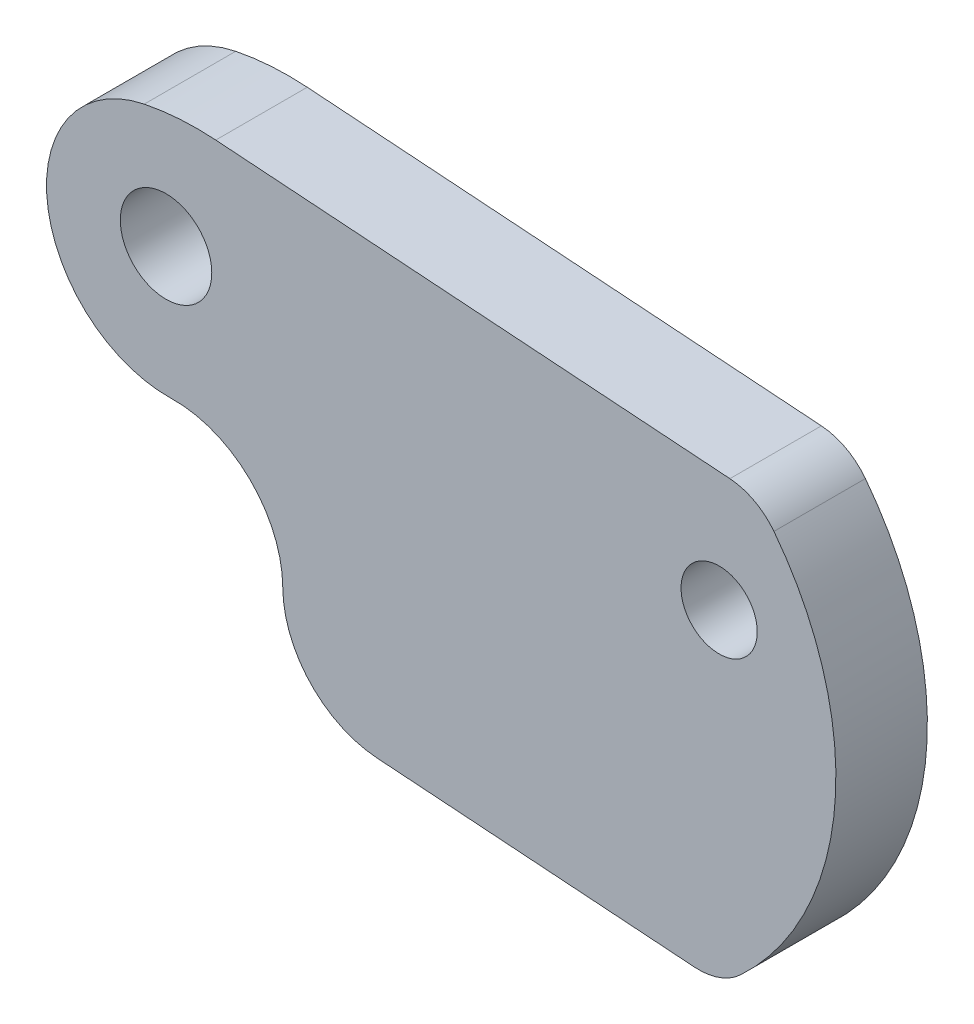
ISO-10303-21;
HEADER;
FILE_DESCRIPTION(('STEP AP214'),'2;1');
FILE_NAME('part.step','',(''),(''),'','','');
FILE_SCHEMA(('AUTOMOTIVE_DESIGN { 1 0 10303 214 1 1 1 1 }'));
ENDSEC;
DATA;
#1=APPLICATION_CONTEXT('core data for automotive mechanical design processes');
#2=APPLICATION_PROTOCOL_DEFINITION('international standard','automotive_design',2000,#1);
#3=PRODUCT_CONTEXT('',#1,'mechanical');
#4=PRODUCT('Part','Part','',(#3));
#5=PRODUCT_RELATED_PRODUCT_CATEGORY('part','',(#4));
#6=PRODUCT_DEFINITION_FORMATION('','',#4);
#7=PRODUCT_DEFINITION_CONTEXT('part definition',#1,'design');
#8=PRODUCT_DEFINITION('design','',#6,#7);
#9=PRODUCT_DEFINITION_SHAPE('','',#8);
#10=(LENGTH_UNIT() NAMED_UNIT(*) SI_UNIT(.MILLI.,.METRE.));
#11=(NAMED_UNIT(*) PLANE_ANGLE_UNIT() SI_UNIT($,.RADIAN.));
#12=(NAMED_UNIT(*) SI_UNIT($,.STERADIAN.) SOLID_ANGLE_UNIT());
#13=UNCERTAINTY_MEASURE_WITH_UNIT(LENGTH_MEASURE(1.E-05),#10,'distance_accuracy_value','');
#14=(GEOMETRIC_REPRESENTATION_CONTEXT(3) GLOBAL_UNCERTAINTY_ASSIGNED_CONTEXT((#13)) GLOBAL_UNIT_ASSIGNED_CONTEXT((#10,
#11,#12)) REPRESENTATION_CONTEXT('',''));
#15=CARTESIAN_POINT('',(0.,0.,0.));
#16=DIRECTION('',(0.,0.,1.));
#17=DIRECTION('',(1.,0.,0.));
#18=AXIS2_PLACEMENT_3D('',#15,#16,#17);
#19=CARTESIAN_POINT('',(1163.33117936609,1704.89898584354,-3.));
#20=DIRECTION('',(0.,0.,1.));
#21=DIRECTION('',(1.,0.,0.));
#22=AXIS2_PLACEMENT_3D('',#19,#20,#21);
#23=CYLINDRICAL_SURFACE('',#22,8.73227138362679);
#24=CARTESIAN_POINT('',(1163.33117936609,1704.89898584354,0.));
#25=DIRECTION('',(0.,0.,1.));
#26=DIRECTION('',(1.,0.,0.));
#27=AXIS2_PLACEMENT_3D('',#24,#25,#26);
#28=CIRCLE('',#27,8.73227138362679);
#29=CARTESIAN_POINT('',(1163.94410284967,1713.60971992975,0.));
#30=VERTEX_POINT('',#29);
#31=CARTESIAN_POINT('',(1161.59842695047,1713.45761497346,0.));
#32=VERTEX_POINT('',#31);
#33=EDGE_CURVE('E151',#30,#32,#28,.T.);
#34=ORIENTED_EDGE('',*,*,#33,.F.);
#35=DIRECTION('',(0.,0.,1.));
#36=VECTOR('',#35,1.);
#37=CARTESIAN_POINT('',(1163.94410284967,1713.60971992975,-3.));
#38=LINE('',#37,#36);
#39=CARTESIAN_POINT('',(1163.94410284967,1713.60971992975,-3.));
#40=VERTEX_POINT('',#39);
#41=EDGE_CURVE('E13',#40,#30,#38,.T.);
#42=ORIENTED_EDGE('',*,*,#41,.F.);
#43=CARTESIAN_POINT('',(1163.33117936609,1704.89898584354,-3.));
#44=DIRECTION('',(0.,0.,1.));
#45=DIRECTION('',(1.,0.,0.));
#46=AXIS2_PLACEMENT_3D('',#43,#44,#45);
#47=CIRCLE('',#46,8.73227138362679);
#48=CARTESIAN_POINT('',(1161.59842695047,1713.45761497346,-3.));
#49=VERTEX_POINT('',#48);
#50=EDGE_CURVE('E175',#40,#49,#47,.T.);
#51=ORIENTED_EDGE('',*,*,#50,.T.);
#52=DIRECTION('',(0.,0.,1.));
#53=VECTOR('',#52,1.);
#54=CARTESIAN_POINT('',(1161.59842695047,1713.45761497346,-3.));
#55=LINE('',#54,#53);
#56=EDGE_CURVE('E51',#49,#32,#55,.T.);
#57=ORIENTED_EDGE('',*,*,#56,.T.);
#58=EDGE_LOOP('',(#34,#42,#51,#57));
#59=FACE_BOUND('',#58,.T.);
#60=ADVANCED_FACE('F48',(#59),#23,.T.);
#61=CARTESIAN_POINT('',(1180.80632932412,1712.42322353468,-3.));
#62=DIRECTION('',(0.0701906132614009,0.997533597333939,0.));
#63=DIRECTION('',(-0.997533597333939,0.0701906132614009,0.));
#64=AXIS2_PLACEMENT_3D('',#61,#62,#63);
#65=PLANE('',#64);
#66=DIRECTION('',(-0.997533597333939,0.0701906132614009,0.));
#67=VECTOR('',#66,1.);
#68=CARTESIAN_POINT('',(1180.80632932412,1712.42322353468,0.));
#69=LINE('',#68,#67);
#70=CARTESIAN_POINT('',(1180.80632932412,1712.42322353468,0.));
#71=VERTEX_POINT('',#70);
#72=EDGE_CURVE('E173',#71,#30,#69,.T.);
#73=ORIENTED_EDGE('',*,*,#72,.F.);
#74=DIRECTION('',(0.,0.,1.));
#75=VECTOR('',#74,1.);
#76=CARTESIAN_POINT('',(1180.80632932412,1712.42322353468,-3.));
#77=LINE('',#76,#75);
#78=CARTESIAN_POINT('',(1180.80632932412,1712.42322353468,-3.));
#79=VERTEX_POINT('',#78);
#80=EDGE_CURVE('E57',#79,#71,#77,.T.);
#81=ORIENTED_EDGE('',*,*,#80,.F.);
#82=DIRECTION('',(-0.997533597333939,0.0701906132614009,0.));
#83=VECTOR('',#82,1.);
#84=CARTESIAN_POINT('',(1180.80632932412,1712.42322353468,-3.));
#85=LINE('',#84,#83);
#86=EDGE_CURVE('E141',#79,#40,#85,.T.);
#87=ORIENTED_EDGE('',*,*,#86,.T.);
#88=ORIENTED_EDGE('',*,*,#41,.T.);
#89=EDGE_LOOP('',(#73,#81,#87,#88));
#90=FACE_BOUND('',#89,.T.);
#91=ADVANCED_FACE('F189',(#90),#65,.T.);
#92=CARTESIAN_POINT('',(1180.6659480976,1710.42815634001,-3.));
#93=DIRECTION('',(0.,0.,1.));
#94=DIRECTION('',(1.,0.,0.));
#95=AXIS2_PLACEMENT_3D('',#92,#93,#94);
#96=CYLINDRICAL_SURFACE('',#95,1.99999999999984);
#97=CARTESIAN_POINT('',(1180.6659480976,1710.42815634001,0.));
#98=DIRECTION('',(0.,0.,1.));
#99=DIRECTION('',(-1.,0.,0.));
#100=AXIS2_PLACEMENT_3D('',#97,#98,#99);
#101=CIRCLE('',#100,1.99999999999984);
#102=CARTESIAN_POINT('',(1182.25072926828,1711.64818447127,0.));
#103=VERTEX_POINT('',#102);
#104=EDGE_CURVE('E128',#103,#71,#101,.T.);
#105=ORIENTED_EDGE('',*,*,#104,.F.);
#106=DIRECTION('',(0.,0.,1.));
#107=VECTOR('',#106,1.);
#108=CARTESIAN_POINT('',(1182.25072926828,1711.64818447127,-3.));
#109=LINE('',#108,#107);
#110=CARTESIAN_POINT('',(1182.25072926828,1711.64818447127,-3.));
#111=VERTEX_POINT('',#110);
#112=EDGE_CURVE('E123',#111,#103,#109,.T.);
#113=ORIENTED_EDGE('',*,*,#112,.F.);
#114=CARTESIAN_POINT('',(1180.6659480976,1710.42815634001,-3.));
#115=DIRECTION('',(0.,0.,1.));
#116=DIRECTION('',(-1.,0.,0.));
#117=AXIS2_PLACEMENT_3D('',#114,#115,#116);
#118=CIRCLE('',#117,1.99999999999984);
#119=EDGE_CURVE('E126',#111,#79,#118,.T.);
#120=ORIENTED_EDGE('',*,*,#119,.T.);
#121=ORIENTED_EDGE('',*,*,#80,.T.);
#122=EDGE_LOOP('',(#105,#113,#120,#121));
#123=FACE_BOUND('',#122,.T.);
#124=ADVANCED_FACE('F125',(#123),#96,.T.);
#125=CARTESIAN_POINT('',(1174.4950828996,1705.67757671737,-3.));
#126=DIRECTION('',(0.,0.,1.));
#127=DIRECTION('',(1.,0.,0.));
#128=AXIS2_PLACEMENT_3D('',#125,#126,#127);
#129=CYLINDRICAL_SURFACE('',#128,9.78765587599625);
#130=CARTESIAN_POINT('',(1174.4950828996,1705.67757671737,0.));
#131=DIRECTION('',(0.,0.,1.));
#132=DIRECTION('',(-1.,0.,0.));
#133=AXIS2_PLACEMENT_3D('',#130,#131,#132);
#134=CIRCLE('',#133,9.78765587599625);
#135=CARTESIAN_POINT('',(1181.14591059589,1698.49672032685,0.));
#136=VERTEX_POINT('',#135);
#137=EDGE_CURVE('E170',#136,#103,#134,.T.);
#138=ORIENTED_EDGE('',*,*,#137,.F.);
#139=DIRECTION('',(0.,0.,1.));
#140=VECTOR('',#139,1.);
#141=CARTESIAN_POINT('',(1181.14591059589,1698.49672032685,-3.));
#142=LINE('',#141,#140);
#143=CARTESIAN_POINT('',(1181.14591059589,1698.49672032685,-3.));
#144=VERTEX_POINT('',#143);
#145=EDGE_CURVE('E133',#144,#136,#142,.T.);
#146=ORIENTED_EDGE('',*,*,#145,.F.);
#147=CARTESIAN_POINT('',(1174.4950828996,1705.67757671737,-3.));
#148=DIRECTION('',(0.,0.,1.));
#149=DIRECTION('',(-1.,0.,0.));
#150=AXIS2_PLACEMENT_3D('',#147,#148,#149);
#151=CIRCLE('',#150,9.78765587599625);
#152=EDGE_CURVE('E139',#144,#111,#151,.T.);
#153=ORIENTED_EDGE('',*,*,#152,.T.);
#154=ORIENTED_EDGE('',*,*,#112,.T.);
#155=EDGE_LOOP('',(#138,#146,#153,#154));
#156=FACE_BOUND('',#155,.T.);
#157=ADVANCED_FACE('F143',(#156),#129,.T.);
#158=CARTESIAN_POINT('',(1179.7868869889,1699.96404947726,-3.));
#159=DIRECTION('',(0.,0.,1.));
#160=DIRECTION('',(1.,0.,0.));
#161=AXIS2_PLACEMENT_3D('',#158,#159,#160);
#162=CYLINDRICAL_SURFACE('',#161,1.9999999999999);
#163=CARTESIAN_POINT('',(1179.7868869889,1699.96404947726,0.));
#164=DIRECTION('',(0.,0.,1.));
#165=DIRECTION('',(1.,0.,0.));
#166=AXIS2_PLACEMENT_3D('',#163,#164,#165);
#167=CIRCLE('',#166,1.9999999999999);
#168=CARTESIAN_POINT('',(1179.64650576238,1697.96898228259,0.));
#169=VERTEX_POINT('',#168);
#170=EDGE_CURVE('E167',#169,#136,#167,.T.);
#171=ORIENTED_EDGE('',*,*,#170,.F.);
#172=DIRECTION('',(0.,0.,1.));
#173=VECTOR('',#172,1.);
#174=CARTESIAN_POINT('',(1179.64650576238,1697.96898228259,-3.));
#175=LINE('',#174,#173);
#176=CARTESIAN_POINT('',(1179.64650576238,1697.96898228259,-3.));
#177=VERTEX_POINT('',#176);
#178=EDGE_CURVE('E179',#177,#169,#175,.T.);
#179=ORIENTED_EDGE('',*,*,#178,.F.);
#180=CARTESIAN_POINT('',(1179.7868869889,1699.96404947726,-3.));
#181=DIRECTION('',(0.,0.,1.));
#182=DIRECTION('',(1.,0.,0.));
#183=AXIS2_PLACEMENT_3D('',#180,#181,#182);
#184=CIRCLE('',#183,1.9999999999999);
#185=EDGE_CURVE('E144',#177,#144,#184,.T.);
#186=ORIENTED_EDGE('',*,*,#185,.T.);
#187=ORIENTED_EDGE('',*,*,#145,.T.);
#188=EDGE_LOOP('',(#171,#179,#186,#187));
#189=FACE_BOUND('',#188,.T.);
#190=ADVANCED_FACE('F202',(#189),#162,.T.);
#191=CARTESIAN_POINT('',(1169.22988432262,1698.7019390962,-3.));
#192=DIRECTION('',(-0.0701906132614025,-0.997533597333939,0.));
#193=DIRECTION('',(0.997533597333939,-0.0701906132614025,0.));
#194=AXIS2_PLACEMENT_3D('',#191,#192,#193);
#195=PLANE('',#194);
#196=DIRECTION('',(0.997533597333939,-0.0701906132614025,0.));
#197=VECTOR('',#196,1.);
#198=CARTESIAN_POINT('',(1169.22988432262,1698.7019390962,0.));
#199=LINE('',#198,#197);
#200=CARTESIAN_POINT('',(1169.22988432262,1698.7019390962,0.));
#201=VERTEX_POINT('',#200);
#202=EDGE_CURVE('E164',#201,#169,#199,.T.);
#203=ORIENTED_EDGE('',*,*,#202,.F.);
#204=DIRECTION('',(0.,0.,1.));
#205=VECTOR('',#204,1.);
#206=CARTESIAN_POINT('',(1169.22988432262,1698.7019390962,-3.));
#207=LINE('',#206,#205);
#208=CARTESIAN_POINT('',(1169.22988432262,1698.7019390962,-3.));
#209=VERTEX_POINT('',#208);
#210=EDGE_CURVE('E181',#209,#201,#207,.T.);
#211=ORIENTED_EDGE('',*,*,#210,.F.);
#212=DIRECTION('',(0.997533597333939,-0.0701906132614025,0.));
#213=VECTOR('',#212,1.);
#214=CARTESIAN_POINT('',(1169.22988432262,1698.7019390962,-3.));
#215=LINE('',#214,#213);
#216=EDGE_CURVE('E146',#209,#177,#215,.T.);
#217=ORIENTED_EDGE('',*,*,#216,.T.);
#218=ORIENTED_EDGE('',*,*,#178,.T.);
#219=EDGE_LOOP('',(#203,#211,#217,#218));
#220=FACE_BOUND('',#219,.T.);
#221=ADVANCED_FACE('F205',(#220),#195,.T.);
#222=CARTESIAN_POINT('',(1169.46299438031,1702.01484809677,-3.));
#223=DIRECTION('',(0.,0.,1.));
#224=DIRECTION('',(1.,0.,0.));
#225=AXIS2_PLACEMENT_3D('',#222,#223,#224);
#226=CYLINDRICAL_SURFACE('',#225,3.32110017088489);
#227=CARTESIAN_POINT('',(1169.46299438031,1702.01484809677,0.));
#228=DIRECTION('',(0.,0.,1.));
#229=DIRECTION('',(1.,0.,0.));
#230=AXIS2_PLACEMENT_3D('',#227,#228,#229);
#231=CIRCLE('',#230,3.32110017088489);
#232=CARTESIAN_POINT('',(1166.14194796575,1701.9959521345,0.));
#233=VERTEX_POINT('',#232);
#234=EDGE_CURVE('E161',#233,#201,#231,.T.);
#235=ORIENTED_EDGE('',*,*,#234,.F.);
#236=DIRECTION('',(0.,0.,1.));
#237=VECTOR('',#236,1.);
#238=CARTESIAN_POINT('',(1166.14194796575,1701.9959521345,-3.));
#239=LINE('',#238,#237);
#240=CARTESIAN_POINT('',(1166.14194796575,1701.9959521345,-3.));
#241=VERTEX_POINT('',#240);
#242=EDGE_CURVE('E183',#241,#233,#239,.T.);
#243=ORIENTED_EDGE('',*,*,#242,.F.);
#244=CARTESIAN_POINT('',(1169.46299438031,1702.01484809677,-3.));
#245=DIRECTION('',(0.,0.,1.));
#246=DIRECTION('',(1.,0.,0.));
#247=AXIS2_PLACEMENT_3D('',#244,#245,#246);
#248=CIRCLE('',#247,3.32110017088489);
#249=EDGE_CURVE('E258',#241,#209,#248,.T.);
#250=ORIENTED_EDGE('',*,*,#249,.T.);
#251=ORIENTED_EDGE('',*,*,#210,.T.);
#252=EDGE_LOOP('',(#235,#243,#250,#251));
#253=FACE_BOUND('',#252,.T.);
#254=ADVANCED_FACE('F209',(#253),#226,.T.);
#255=CARTESIAN_POINT('',(1162.57534174844,1701.9756589955,-3.));
#256=DIRECTION('',(0.,0.,1.));
#257=DIRECTION('',(1.,0.,0.));
#258=AXIS2_PLACEMENT_3D('',#255,#256,#257);
#259=CYLINDRICAL_SURFACE('',#258,3.56666394840348);
#260=CARTESIAN_POINT('',(1162.57534174844,1701.9756589955,0.));
#261=DIRECTION('',(0.,0.,-1.));
#262=DIRECTION('',(-1.,0.,0.));
#263=AXIS2_PLACEMENT_3D('',#260,#261,#262);
#264=CIRCLE('',#263,3.56666394840348);
#265=CARTESIAN_POINT('',(1162.48883577837,1705.54127373043,0.));
#266=VERTEX_POINT('',#265);
#267=EDGE_CURVE('E158',#266,#233,#264,.T.);
#268=ORIENTED_EDGE('',*,*,#267,.F.);
#269=DIRECTION('',(0.,0.,1.));
#270=VECTOR('',#269,1.);
#271=CARTESIAN_POINT('',(1162.48883577837,1705.54127373043,-3.));
#272=LINE('',#271,#270);
#273=CARTESIAN_POINT('',(1162.48883577837,1705.54127373043,-3.));
#274=VERTEX_POINT('',#273);
#275=EDGE_CURVE('E184',#274,#266,#272,.T.);
#276=ORIENTED_EDGE('',*,*,#275,.F.);
#277=CARTESIAN_POINT('',(1162.57534174844,1701.9756589955,-3.));
#278=DIRECTION('',(0.,0.,-1.));
#279=DIRECTION('',(-1.,0.,0.));
#280=AXIS2_PLACEMENT_3D('',#277,#278,#279);
#281=CIRCLE('',#280,3.56666394840348);
#282=EDGE_CURVE('E255',#274,#241,#281,.T.);
#283=ORIENTED_EDGE('',*,*,#282,.T.);
#284=ORIENTED_EDGE('',*,*,#242,.T.);
#285=EDGE_LOOP('',(#268,#276,#283,#284));
#286=FACE_BOUND('',#285,.T.);
#287=ADVANCED_FACE('F213',(#286),#259,.F.);
#288=CARTESIAN_POINT('',(1162.39185569955,1709.53861169107,-3.));
#289=DIRECTION('',(0.,0.,1.));
#290=DIRECTION('',(1.,0.,0.));
#291=AXIS2_PLACEMENT_3D('',#288,#289,#290);
#292=CYLINDRICAL_SURFACE('',#291,3.99851421245832);
#293=CARTESIAN_POINT('',(1162.39185569955,1709.53861169107,0.));
#294=DIRECTION('',(0.,0.,1.));
#295=DIRECTION('',(1.,0.,0.));
#296=AXIS2_PLACEMENT_3D('',#293,#294,#295);
#297=CIRCLE('',#296,3.99851421245832);
#298=EDGE_CURVE('E154',#32,#266,#297,.T.);
#299=ORIENTED_EDGE('',*,*,#298,.F.);
#300=ORIENTED_EDGE('',*,*,#56,.F.);
#301=CARTESIAN_POINT('',(1162.39185569955,1709.53861169107,-3.));
#302=DIRECTION('',(0.,0.,1.));
#303=DIRECTION('',(1.,0.,0.));
#304=AXIS2_PLACEMENT_3D('',#301,#302,#303);
#305=CIRCLE('',#304,3.99851421245832);
#306=EDGE_CURVE('E253',#49,#274,#305,.T.);
#307=ORIENTED_EDGE('',*,*,#306,.T.);
#308=ORIENTED_EDGE('',*,*,#275,.T.);
#309=EDGE_LOOP('',(#299,#300,#307,#308));
#310=FACE_BOUND('',#309,.T.);
#311=ADVANCED_FACE('F186',(#310),#292,.T.);
#312=CARTESIAN_POINT('',(1163.33117936609,1704.89898584354,-3.));
#313=DIRECTION('',(0.,0.,1.));
#314=DIRECTION('',(1.,0.,0.));
#315=AXIS2_PLACEMENT_3D('',#312,#313,#314);
#316=PLANE('',#315);
#317=CARTESIAN_POINT('',(1162.31301041985,1709.77153578605,-3.));
#318=DIRECTION('',(0.,0.,1.));
#319=DIRECTION('',(1.,0.,0.));
#320=AXIS2_PLACEMENT_3D('',#317,#318,#319);
#321=CIRCLE('',#320,1.50000000000011);
#322=CARTESIAN_POINT('',(1163.81301041985,1709.77153578605,-3.));
#323=VERTEX_POINT('',#322);
#324=EDGE_CURVE('E240',#323,#323,#321,.T.);
#325=ORIENTED_EDGE('',*,*,#324,.T.);
#326=EDGE_LOOP('',(#325));
#327=FACE_BOUND('',#326,.T.);
#328=CARTESIAN_POINT('',(1180.45306793527,1708.51760157808,-3.));
#329=DIRECTION('',(0.,0.,1.));
#330=DIRECTION('',(1.,0.,0.));
#331=AXIS2_PLACEMENT_3D('',#328,#329,#330);
#332=CIRCLE('',#331,1.25000000000008);
#333=CARTESIAN_POINT('',(1181.70306793527,1708.51760157808,-3.));
#334=VERTEX_POINT('',#333);
#335=EDGE_CURVE('E155',#334,#334,#332,.T.);
#336=ORIENTED_EDGE('',*,*,#335,.T.);
#337=EDGE_LOOP('',(#336));
#338=FACE_BOUND('',#337,.T.);
#339=ORIENTED_EDGE('',*,*,#50,.F.);
#340=ORIENTED_EDGE('',*,*,#86,.F.);
#341=ORIENTED_EDGE('',*,*,#119,.F.);
#342=ORIENTED_EDGE('',*,*,#152,.F.);
#343=ORIENTED_EDGE('',*,*,#185,.F.);
#344=ORIENTED_EDGE('',*,*,#216,.F.);
#345=ORIENTED_EDGE('',*,*,#249,.F.);
#346=ORIENTED_EDGE('',*,*,#282,.F.);
#347=ORIENTED_EDGE('',*,*,#306,.F.);
#348=EDGE_LOOP('',(#339,#340,#341,#342,#343,#344,#345,#346,#347));
#349=FACE_BOUND('',#348,.T.);
#350=ADVANCED_FACE('F137',(#327,#338,#349),#316,.F.);
#351=CARTESIAN_POINT('',(1163.33117936609,1704.89898584354,0.));
#352=DIRECTION('',(0.,0.,1.));
#353=DIRECTION('',(1.,0.,0.));
#354=AXIS2_PLACEMENT_3D('',#351,#352,#353);
#355=PLANE('',#354);
#356=CARTESIAN_POINT('',(1162.31301041985,1709.77153578605,0.));
#357=DIRECTION('',(0.,0.,1.));
#358=DIRECTION('',(1.,0.,0.));
#359=AXIS2_PLACEMENT_3D('',#356,#357,#358);
#360=CIRCLE('',#359,1.50000000000011);
#361=CARTESIAN_POINT('',(1163.81301041985,1709.77153578605,0.));
#362=VERTEX_POINT('',#361);
#363=EDGE_CURVE('E243',#362,#362,#360,.T.);
#364=ORIENTED_EDGE('',*,*,#363,.F.);
#365=EDGE_LOOP('',(#364));
#366=FACE_BOUND('',#365,.T.);
#367=CARTESIAN_POINT('',(1180.45306793527,1708.51760157808,0.));
#368=DIRECTION('',(0.,0.,1.));
#369=DIRECTION('',(1.,0.,0.));
#370=AXIS2_PLACEMENT_3D('',#367,#368,#369);
#371=CIRCLE('',#370,1.25000000000008);
#372=CARTESIAN_POINT('',(1181.70306793527,1708.51760157808,0.));
#373=VERTEX_POINT('',#372);
#374=EDGE_CURVE('E245',#373,#373,#371,.T.);
#375=ORIENTED_EDGE('',*,*,#374,.F.);
#376=EDGE_LOOP('',(#375));
#377=FACE_BOUND('',#376,.T.);
#378=ORIENTED_EDGE('',*,*,#33,.T.);
#379=ORIENTED_EDGE('',*,*,#298,.T.);
#380=ORIENTED_EDGE('',*,*,#267,.T.);
#381=ORIENTED_EDGE('',*,*,#234,.T.);
#382=ORIENTED_EDGE('',*,*,#202,.T.);
#383=ORIENTED_EDGE('',*,*,#170,.T.);
#384=ORIENTED_EDGE('',*,*,#137,.T.);
#385=ORIENTED_EDGE('',*,*,#104,.T.);
#386=ORIENTED_EDGE('',*,*,#72,.T.);
#387=EDGE_LOOP('',(#378,#379,#380,#381,#382,#383,#384,#385,#386));
#388=FACE_BOUND('',#387,.T.);
#389=ADVANCED_FACE('F188',(#366,#377,#388),#355,.T.);
#390=CARTESIAN_POINT('',(1180.45306793527,1708.51760157808,-3.));
#391=DIRECTION('',(0.,0.,1.));
#392=DIRECTION('',(1.,0.,0.));
#393=AXIS2_PLACEMENT_3D('',#390,#391,#392);
#394=CYLINDRICAL_SURFACE('',#393,1.25000000000008);
#395=ORIENTED_EDGE('',*,*,#335,.F.);
#396=EDGE_LOOP('',(#395));
#397=FACE_BOUND('',#396,.T.);
#398=ORIENTED_EDGE('',*,*,#374,.T.);
#399=EDGE_LOOP('',(#398));
#400=FACE_BOUND('',#399,.T.);
#401=ADVANCED_FACE('F225',(#397,#400),#394,.F.);
#402=CARTESIAN_POINT('',(1162.31301041985,1709.77153578605,-3.));
#403=DIRECTION('',(0.,0.,1.));
#404=DIRECTION('',(1.,0.,0.));
#405=AXIS2_PLACEMENT_3D('',#402,#403,#404);
#406=CYLINDRICAL_SURFACE('',#405,1.50000000000011);
#407=ORIENTED_EDGE('',*,*,#324,.F.);
#408=EDGE_LOOP('',(#407));
#409=FACE_BOUND('',#408,.T.);
#410=ORIENTED_EDGE('',*,*,#363,.T.);
#411=EDGE_LOOP('',(#410));
#412=FACE_BOUND('',#411,.T.);
#413=ADVANCED_FACE('F232',(#409,#412),#406,.F.);
#414=CLOSED_SHELL('',(#60,#91,#124,#157,#190,#221,#254,#287,#311,#350,#389,#401,#413));
#415=MANIFOLD_SOLID_BREP('B2',#414);
#416=ADVANCED_BREP_SHAPE_REPRESENTATION('',(#18,#415),#14);
#417=SHAPE_DEFINITION_REPRESENTATION(#9,#416);
ENDSEC;
END-ISO-10303-21;
